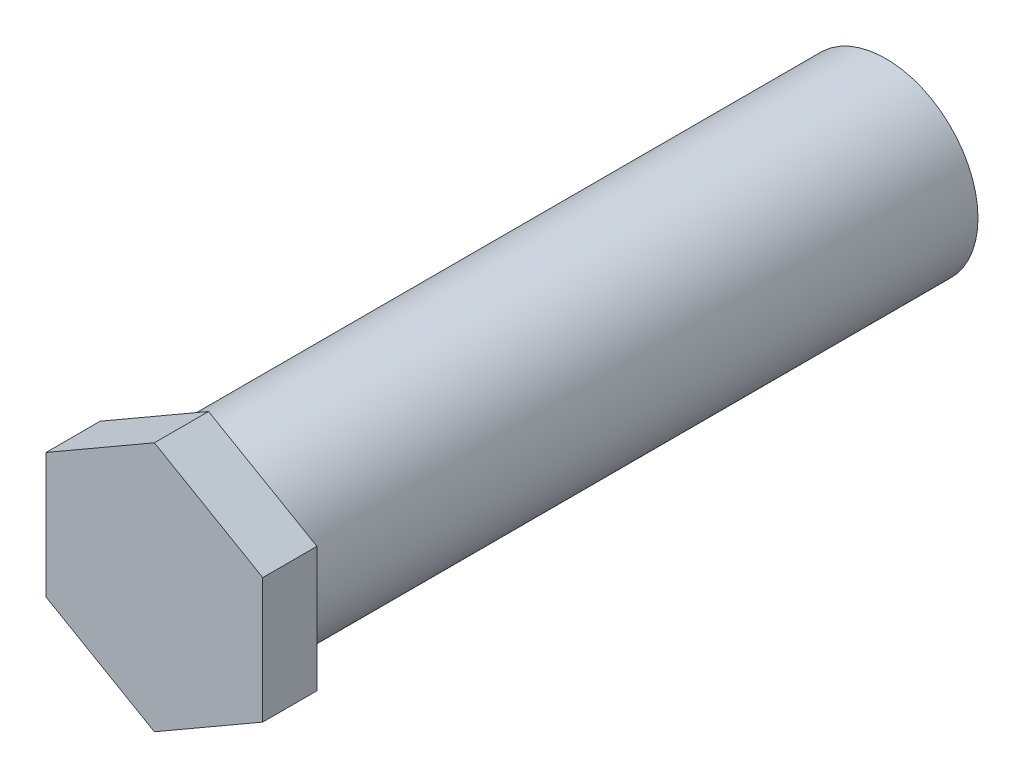
ISO-10303-21;
HEADER;
FILE_DESCRIPTION(('STEP AP214'),'2;1');
FILE_NAME('part.step','',(''),(''),'','','');
FILE_SCHEMA(('AUTOMOTIVE_DESIGN { 1 0 10303 214 1 1 1 1 }'));
ENDSEC;
DATA;
#1=APPLICATION_CONTEXT('core data for automotive mechanical design processes');
#2=APPLICATION_PROTOCOL_DEFINITION('international standard','automotive_design',2000,#1);
#3=PRODUCT_CONTEXT('',#1,'mechanical');
#4=PRODUCT('Part','Part','',(#3));
#5=PRODUCT_RELATED_PRODUCT_CATEGORY('part','',(#4));
#6=PRODUCT_DEFINITION_FORMATION('','',#4);
#7=PRODUCT_DEFINITION_CONTEXT('part definition',#1,'design');
#8=PRODUCT_DEFINITION('design','',#6,#7);
#9=PRODUCT_DEFINITION_SHAPE('','',#8);
#10=(LENGTH_UNIT() NAMED_UNIT(*) SI_UNIT(.MILLI.,.METRE.));
#11=(NAMED_UNIT(*) PLANE_ANGLE_UNIT() SI_UNIT($,.RADIAN.));
#12=(NAMED_UNIT(*) SI_UNIT($,.STERADIAN.) SOLID_ANGLE_UNIT());
#13=UNCERTAINTY_MEASURE_WITH_UNIT(LENGTH_MEASURE(1.E-05),#10,'distance_accuracy_value','');
#14=(GEOMETRIC_REPRESENTATION_CONTEXT(3) GLOBAL_UNCERTAINTY_ASSIGNED_CONTEXT((#13)) GLOBAL_UNIT_ASSIGNED_CONTEXT((#10,
#11,#12)) REPRESENTATION_CONTEXT('',''));
#15=CARTESIAN_POINT('',(0.,0.,0.));
#16=DIRECTION('',(0.,0.,1.));
#17=DIRECTION('',(1.,0.,0.));
#18=AXIS2_PLACEMENT_3D('',#15,#16,#17);
#19=CARTESIAN_POINT('',(0.,0.,-25.));
#20=DIRECTION('',(0.,0.,1.));
#21=DIRECTION('',(1.,0.,0.));
#22=AXIS2_PLACEMENT_3D('',#19,#20,#21);
#23=CYLINDRICAL_SURFACE('',#22,3.4);
#24=CARTESIAN_POINT('',(0.,0.,-25.));
#25=DIRECTION('',(0.,0.,1.));
#26=DIRECTION('',(1.,0.,0.));
#27=AXIS2_PLACEMENT_3D('',#24,#25,#26);
#28=CIRCLE('',#27,3.4);
#29=CARTESIAN_POINT('',(3.4,0.,-25.));
#30=VERTEX_POINT('',#29);
#31=EDGE_CURVE('E11',#30,#30,#28,.T.);
#32=ORIENTED_EDGE('',*,*,#31,.T.);
#33=EDGE_LOOP('',(#32));
#34=FACE_BOUND('',#33,.T.);
#35=CARTESIAN_POINT('',(0.,0.,0.));
#36=DIRECTION('',(0.,0.,1.));
#37=DIRECTION('',(1.,0.,0.));
#38=AXIS2_PLACEMENT_3D('',#35,#36,#37);
#39=CIRCLE('',#38,3.4);
#40=CARTESIAN_POINT('',(3.4,0.,0.));
#41=VERTEX_POINT('',#40);
#42=EDGE_CURVE('E37',#41,#41,#39,.T.);
#43=ORIENTED_EDGE('',*,*,#42,.F.);
#44=EDGE_LOOP('',(#43));
#45=FACE_BOUND('',#44,.T.);
#46=ADVANCED_FACE('F34',(#34,#45),#23,.T.);
#47=CARTESIAN_POINT('',(0.,0.,-25.));
#48=DIRECTION('',(0.,0.,1.));
#49=DIRECTION('',(1.,0.,0.));
#50=AXIS2_PLACEMENT_3D('',#47,#48,#49);
#51=PLANE('',#50);
#52=ORIENTED_EDGE('',*,*,#31,.F.);
#53=EDGE_LOOP('',(#52));
#54=FACE_BOUND('',#53,.T.);
#55=ADVANCED_FACE('F145',(#54),#51,.F.);
#56=CARTESIAN_POINT('',(-4.,2.3094010767585,2.));
#57=DIRECTION('',(1.,0.,0.));
#58=DIRECTION('',(0.,1.,0.));
#59=AXIS2_PLACEMENT_3D('',#56,#57,#58);
#60=PLANE('',#59);
#61=DIRECTION('',(0.,-1.,0.));
#62=VECTOR('',#61,1.);
#63=CARTESIAN_POINT('',(-4.,2.3094010767585,0.));
#64=LINE('',#63,#62);
#65=CARTESIAN_POINT('',(-4.,2.3094010767585,0.));
#66=VERTEX_POINT('',#65);
#67=CARTESIAN_POINT('',(-4.,-2.3094010767585,0.));
#68=VERTEX_POINT('',#67);
#69=EDGE_CURVE('E119',#66,#68,#64,.T.);
#70=ORIENTED_EDGE('',*,*,#69,.T.);
#71=DIRECTION('',(0.,0.,-1.));
#72=VECTOR('',#71,1.);
#73=CARTESIAN_POINT('',(-4.,-2.3094010767585,2.));
#74=LINE('',#73,#72);
#75=CARTESIAN_POINT('',(-4.,-2.3094010767585,2.));
#76=VERTEX_POINT('',#75);
#77=EDGE_CURVE('E136',#76,#68,#74,.T.);
#78=ORIENTED_EDGE('',*,*,#77,.F.);
#79=DIRECTION('',(0.,-1.,0.));
#80=VECTOR('',#79,1.);
#81=CARTESIAN_POINT('',(-4.,2.3094010767585,2.));
#82=LINE('',#81,#80);
#83=CARTESIAN_POINT('',(-4.,2.3094010767585,2.));
#84=VERTEX_POINT('',#83);
#85=EDGE_CURVE('E129',#84,#76,#82,.T.);
#86=ORIENTED_EDGE('',*,*,#85,.F.);
#87=DIRECTION('',(0.,0.,-1.));
#88=VECTOR('',#87,1.);
#89=CARTESIAN_POINT('',(-4.,2.3094010767585,2.));
#90=LINE('',#89,#88);
#91=EDGE_CURVE('E115',#84,#66,#90,.T.);
#92=ORIENTED_EDGE('',*,*,#91,.T.);
#93=EDGE_LOOP('',(#70,#78,#86,#92));
#94=FACE_BOUND('',#93,.T.);
#95=ADVANCED_FACE('F150',(#94),#60,.F.);
#96=CARTESIAN_POINT('',(-4.,-2.3094010767585,2.));
#97=DIRECTION('',(0.5,0.866025403784439,0.));
#98=DIRECTION('',(-0.866025403784439,0.5,0.));
#99=AXIS2_PLACEMENT_3D('',#96,#97,#98);
#100=PLANE('',#99);
#101=DIRECTION('',(0.866025403784439,-0.5,0.));
#102=VECTOR('',#101,1.);
#103=CARTESIAN_POINT('',(-4.,-2.3094010767585,0.));
#104=LINE('',#103,#102);
#105=CARTESIAN_POINT('',(0.,-4.61880215351701,0.));
#106=VERTEX_POINT('',#105);
#107=EDGE_CURVE('E122',#68,#106,#104,.T.);
#108=ORIENTED_EDGE('',*,*,#107,.T.);
#109=DIRECTION('',(0.,0.,-1.));
#110=VECTOR('',#109,1.);
#111=CARTESIAN_POINT('',(0.,-4.61880215351701,2.));
#112=LINE('',#111,#110);
#113=CARTESIAN_POINT('',(0.,-4.61880215351701,2.));
#114=VERTEX_POINT('',#113);
#115=EDGE_CURVE('E133',#114,#106,#112,.T.);
#116=ORIENTED_EDGE('',*,*,#115,.F.);
#117=DIRECTION('',(0.866025403784439,-0.5,0.));
#118=VECTOR('',#117,1.);
#119=CARTESIAN_POINT('',(-4.,-2.3094010767585,2.));
#120=LINE('',#119,#118);
#121=EDGE_CURVE('E88',#76,#114,#120,.T.);
#122=ORIENTED_EDGE('',*,*,#121,.F.);
#123=ORIENTED_EDGE('',*,*,#77,.T.);
#124=EDGE_LOOP('',(#108,#116,#122,#123));
#125=FACE_BOUND('',#124,.T.);
#126=ADVANCED_FACE('F156',(#125),#100,.F.);
#127=CARTESIAN_POINT('',(0.,-4.61880215351701,2.));
#128=DIRECTION('',(-0.5,0.866025403784438,0.));
#129=DIRECTION('',(-0.866025403784438,-0.5,0.));
#130=AXIS2_PLACEMENT_3D('',#127,#128,#129);
#131=PLANE('',#130);
#132=DIRECTION('',(0.866025403784438,0.5,0.));
#133=VECTOR('',#132,1.);
#134=CARTESIAN_POINT('',(0.,-4.61880215351701,0.));
#135=LINE('',#134,#133);
#136=CARTESIAN_POINT('',(4.,-2.3094010767585,0.));
#137=VERTEX_POINT('',#136);
#138=EDGE_CURVE('E124',#106,#137,#135,.T.);
#139=ORIENTED_EDGE('',*,*,#138,.T.);
#140=DIRECTION('',(0.,0.,-1.));
#141=VECTOR('',#140,1.);
#142=CARTESIAN_POINT('',(4.,-2.3094010767585,2.));
#143=LINE('',#142,#141);
#144=CARTESIAN_POINT('',(4.,-2.3094010767585,2.));
#145=VERTEX_POINT('',#144);
#146=EDGE_CURVE('E110',#145,#137,#143,.T.);
#147=ORIENTED_EDGE('',*,*,#146,.F.);
#148=DIRECTION('',(0.866025403784438,0.5,0.));
#149=VECTOR('',#148,1.);
#150=CARTESIAN_POINT('',(0.,-4.61880215351701,2.));
#151=LINE('',#150,#149);
#152=EDGE_CURVE('E101',#114,#145,#151,.T.);
#153=ORIENTED_EDGE('',*,*,#152,.F.);
#154=ORIENTED_EDGE('',*,*,#115,.T.);
#155=EDGE_LOOP('',(#139,#147,#153,#154));
#156=FACE_BOUND('',#155,.T.);
#157=ADVANCED_FACE('F162',(#156),#131,.F.);
#158=CARTESIAN_POINT('',(4.,-2.3094010767585,2.));
#159=DIRECTION('',(-1.,0.,0.));
#160=DIRECTION('',(0.,-1.,0.));
#161=AXIS2_PLACEMENT_3D('',#158,#159,#160);
#162=PLANE('',#161);
#163=DIRECTION('',(0.,1.,0.));
#164=VECTOR('',#163,1.);
#165=CARTESIAN_POINT('',(4.,-2.3094010767585,0.));
#166=LINE('',#165,#164);
#167=CARTESIAN_POINT('',(4.,2.30940107675851,0.));
#168=VERTEX_POINT('',#167);
#169=EDGE_CURVE('E109',#137,#168,#166,.T.);
#170=ORIENTED_EDGE('',*,*,#169,.T.);
#171=DIRECTION('',(0.,0.,-1.));
#172=VECTOR('',#171,1.);
#173=CARTESIAN_POINT('',(4.,2.30940107675851,2.));
#174=LINE('',#173,#172);
#175=CARTESIAN_POINT('',(4.,2.30940107675851,2.));
#176=VERTEX_POINT('',#175);
#177=EDGE_CURVE('E106',#176,#168,#174,.T.);
#178=ORIENTED_EDGE('',*,*,#177,.F.);
#179=DIRECTION('',(0.,1.,0.));
#180=VECTOR('',#179,1.);
#181=CARTESIAN_POINT('',(4.,-2.3094010767585,2.));
#182=LINE('',#181,#180);
#183=EDGE_CURVE('E95',#145,#176,#182,.T.);
#184=ORIENTED_EDGE('',*,*,#183,.F.);
#185=ORIENTED_EDGE('',*,*,#146,.T.);
#186=EDGE_LOOP('',(#170,#178,#184,#185));
#187=FACE_BOUND('',#186,.T.);
#188=ADVANCED_FACE('F107',(#187),#162,.F.);
#189=CARTESIAN_POINT('',(4.,2.30940107675851,2.));
#190=DIRECTION('',(-0.5,-0.866025403784439,0.));
#191=DIRECTION('',(0.866025403784439,-0.5,0.));
#192=AXIS2_PLACEMENT_3D('',#189,#190,#191);
#193=PLANE('',#192);
#194=DIRECTION('',(-0.866025403784439,0.5,0.));
#195=VECTOR('',#194,1.);
#196=CARTESIAN_POINT('',(4.,2.30940107675851,0.));
#197=LINE('',#196,#195);
#198=CARTESIAN_POINT('',(0.,4.61880215351701,0.));
#199=VERTEX_POINT('',#198);
#200=EDGE_CURVE('E73',#168,#199,#197,.T.);
#201=ORIENTED_EDGE('',*,*,#200,.T.);
#202=DIRECTION('',(0.,0.,-1.));
#203=VECTOR('',#202,1.);
#204=CARTESIAN_POINT('',(0.,4.61880215351701,2.));
#205=LINE('',#204,#203);
#206=CARTESIAN_POINT('',(0.,4.61880215351701,2.));
#207=VERTEX_POINT('',#206);
#208=EDGE_CURVE('E111',#207,#199,#205,.T.);
#209=ORIENTED_EDGE('',*,*,#208,.F.);
#210=DIRECTION('',(-0.866025403784439,0.5,0.));
#211=VECTOR('',#210,1.);
#212=CARTESIAN_POINT('',(4.,2.30940107675851,2.));
#213=LINE('',#212,#211);
#214=EDGE_CURVE('E99',#176,#207,#213,.T.);
#215=ORIENTED_EDGE('',*,*,#214,.F.);
#216=ORIENTED_EDGE('',*,*,#177,.T.);
#217=EDGE_LOOP('',(#201,#209,#215,#216));
#218=FACE_BOUND('',#217,.T.);
#219=ADVANCED_FACE('F113',(#218),#193,.F.);
#220=CARTESIAN_POINT('',(0.,4.61880215351701,2.));
#221=DIRECTION('',(0.500000000000001,-0.866025403784438,0.));
#222=DIRECTION('',(0.866025403784438,0.500000000000001,0.));
#223=AXIS2_PLACEMENT_3D('',#220,#221,#222);
#224=PLANE('',#223);
#225=DIRECTION('',(-0.866025403784438,-0.5,0.));
#226=VECTOR('',#225,1.);
#227=CARTESIAN_POINT('',(0.,4.61880215351701,0.));
#228=LINE('',#227,#226);
#229=EDGE_CURVE('E79',#199,#66,#228,.T.);
#230=ORIENTED_EDGE('',*,*,#229,.T.);
#231=ORIENTED_EDGE('',*,*,#91,.F.);
#232=DIRECTION('',(-0.866025403784438,-0.5,0.));
#233=VECTOR('',#232,1.);
#234=CARTESIAN_POINT('',(0.,4.61880215351701,2.));
#235=LINE('',#234,#233);
#236=EDGE_CURVE('E50',#207,#84,#235,.T.);
#237=ORIENTED_EDGE('',*,*,#236,.F.);
#238=ORIENTED_EDGE('',*,*,#208,.T.);
#239=EDGE_LOOP('',(#230,#231,#237,#238));
#240=FACE_BOUND('',#239,.T.);
#241=ADVANCED_FACE('F170',(#240),#224,.F.);
#242=CARTESIAN_POINT('',(0.,0.,2.));
#243=DIRECTION('',(0.,0.,1.));
#244=DIRECTION('',(1.,0.,0.));
#245=AXIS2_PLACEMENT_3D('',#242,#243,#244);
#246=PLANE('',#245);
#247=ORIENTED_EDGE('',*,*,#85,.T.);
#248=ORIENTED_EDGE('',*,*,#121,.T.);
#249=ORIENTED_EDGE('',*,*,#152,.T.);
#250=ORIENTED_EDGE('',*,*,#183,.T.);
#251=ORIENTED_EDGE('',*,*,#214,.T.);
#252=ORIENTED_EDGE('',*,*,#236,.T.);
#253=EDGE_LOOP('',(#247,#248,#249,#250,#251,#252));
#254=FACE_BOUND('',#253,.T.);
#255=ADVANCED_FACE('F97',(#254),#246,.T.);
#256=CARTESIAN_POINT('',(0.,0.,0.));
#257=DIRECTION('',(0.,0.,1.));
#258=DIRECTION('',(1.,0.,0.));
#259=AXIS2_PLACEMENT_3D('',#256,#257,#258);
#260=PLANE('',#259);
#261=ORIENTED_EDGE('',*,*,#42,.T.);
#262=EDGE_LOOP('',(#261));
#263=FACE_BOUND('',#262,.T.);
#264=ORIENTED_EDGE('',*,*,#69,.F.);
#265=ORIENTED_EDGE('',*,*,#229,.F.);
#266=ORIENTED_EDGE('',*,*,#200,.F.);
#267=ORIENTED_EDGE('',*,*,#169,.F.);
#268=ORIENTED_EDGE('',*,*,#138,.F.);
#269=ORIENTED_EDGE('',*,*,#107,.F.);
#270=EDGE_LOOP('',(#264,#265,#266,#267,#268,#269));
#271=FACE_BOUND('',#270,.T.);
#272=ADVANCED_FACE('F141',(#263,#271),#260,.F.);
#273=CLOSED_SHELL('',(#46,#55,#95,#126,#157,#188,#219,#241,#255,#272));
#274=MANIFOLD_SOLID_BREP('B2',#273);
#275=ADVANCED_BREP_SHAPE_REPRESENTATION('',(#18,#274),#14);
#276=SHAPE_DEFINITION_REPRESENTATION(#9,#275);
ENDSEC;
END-ISO-10303-21;
